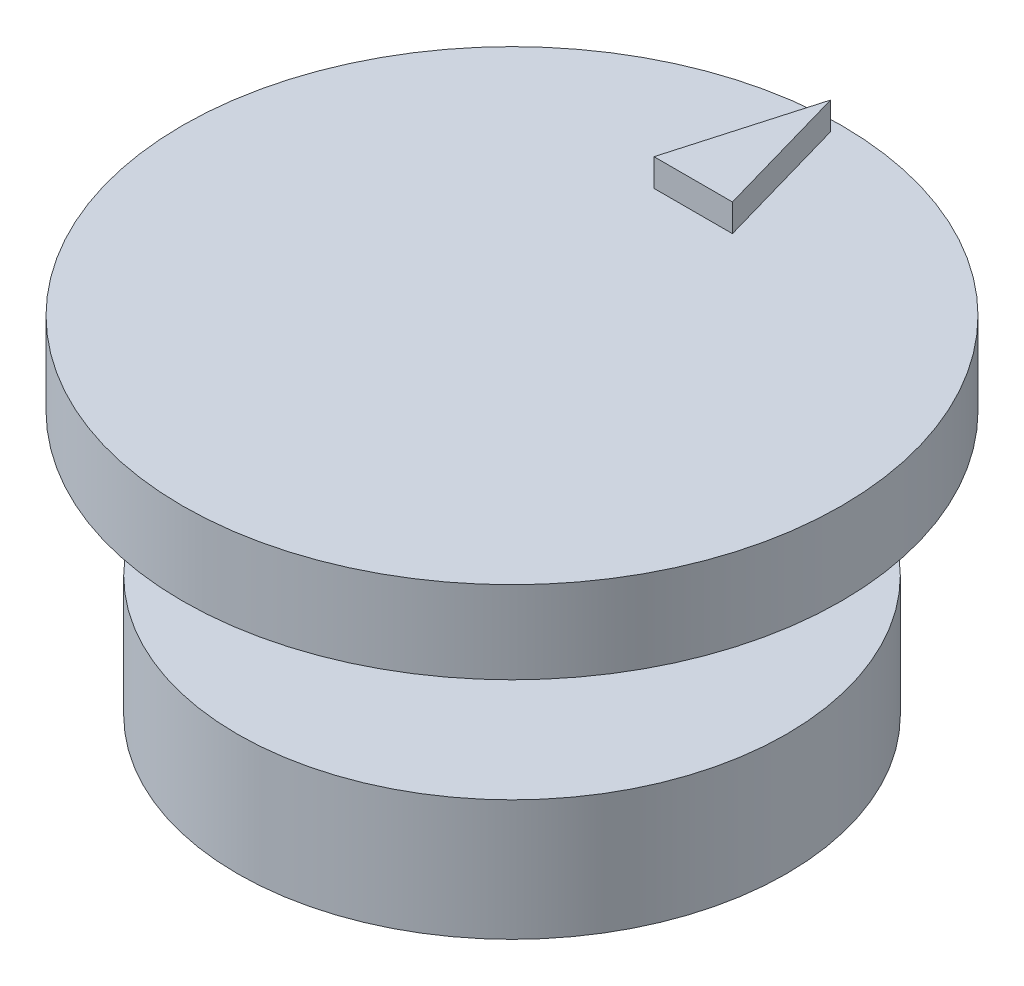
ISO-10303-21;
HEADER;
FILE_DESCRIPTION(('STEP AP214'),'2;1');
FILE_NAME('part.step','',(''),(''),'','','');
FILE_SCHEMA(('AUTOMOTIVE_DESIGN { 1 0 10303 214 1 1 1 1 }'));
ENDSEC;
DATA;
#1=APPLICATION_CONTEXT('core data for automotive mechanical design processes');
#2=APPLICATION_PROTOCOL_DEFINITION('international standard','automotive_design',2000,#1);
#3=PRODUCT_CONTEXT('',#1,'mechanical');
#4=PRODUCT('Part','Part','',(#3));
#5=PRODUCT_RELATED_PRODUCT_CATEGORY('part','',(#4));
#6=PRODUCT_DEFINITION_FORMATION('','',#4);
#7=PRODUCT_DEFINITION_CONTEXT('part definition',#1,'design');
#8=PRODUCT_DEFINITION('design','',#6,#7);
#9=PRODUCT_DEFINITION_SHAPE('','',#8);
#10=(LENGTH_UNIT() NAMED_UNIT(*) SI_UNIT(.MILLI.,.METRE.));
#11=(NAMED_UNIT(*) PLANE_ANGLE_UNIT() SI_UNIT($,.RADIAN.));
#12=(NAMED_UNIT(*) SI_UNIT($,.STERADIAN.) SOLID_ANGLE_UNIT());
#13=UNCERTAINTY_MEASURE_WITH_UNIT(LENGTH_MEASURE(1.E-05),#10,'distance_accuracy_value','');
#14=(GEOMETRIC_REPRESENTATION_CONTEXT(3) GLOBAL_UNCERTAINTY_ASSIGNED_CONTEXT((#13)) GLOBAL_UNIT_ASSIGNED_CONTEXT((#10,
#11,#12)) REPRESENTATION_CONTEXT('',''));
#15=CARTESIAN_POINT('',(0.,0.,0.));
#16=DIRECTION('',(0.,0.,1.));
#17=DIRECTION('',(1.,0.,0.));
#18=AXIS2_PLACEMENT_3D('',#15,#16,#17);
#19=CARTESIAN_POINT('',(0.,-36.8930584239754,0.));
#20=DIRECTION('',(0.,1.,0.));
#21=DIRECTION('',(-1.,0.,0.));
#22=AXIS2_PLACEMENT_3D('',#19,#20,#21);
#23=PLANE('',#22);
#24=CARTESIAN_POINT('',(0.,-36.8930584239754,0.));
#25=DIRECTION('',(0.,1.,0.));
#26=DIRECTION('',(-1.,0.,0.));
#27=AXIS2_PLACEMENT_3D('',#24,#25,#26);
#28=CIRCLE('',#27,12.7);
#29=CARTESIAN_POINT('',(-12.7,-36.8930584239754,0.));
#30=VERTEX_POINT('',#29);
#31=EDGE_CURVE('E40',#30,#30,#28,.T.);
#32=ORIENTED_EDGE('',*,*,#31,.F.);
#33=EDGE_LOOP('',(#32));
#34=FACE_BOUND('',#33,.T.);
#35=CARTESIAN_POINT('',(0.,-36.8930584239754,-9.85491099897473));
#36=DIRECTION('',(0.,1.,0.));
#37=DIRECTION('',(-1.,0.,0.));
#38=AXIS2_PLACEMENT_3D('',#35,#36,#37);
#39=CIRCLE('',#38,2.286);
#40=CARTESIAN_POINT('',(-2.286,-36.8930584239754,-9.85491099897473));
#41=VERTEX_POINT('',#40);
#42=EDGE_CURVE('E11',#41,#41,#39,.F.);
#43=ORIENTED_EDGE('',*,*,#42,.F.);
#44=EDGE_LOOP('',(#43));
#45=FACE_BOUND('',#44,.T.);
#46=ADVANCED_FACE('F32',(#34,#45),#23,.F.);
#47=CARTESIAN_POINT('',(15.24,-20.8910584239754,0.));
#48=DIRECTION('',(0.,-1.,0.));
#49=DIRECTION('',(1.,0.,0.));
#50=AXIS2_PLACEMENT_3D('',#47,#48,#49);
#51=PLANE('',#50);
#52=CARTESIAN_POINT('',(0.,-20.8910584239754,0.));
#53=DIRECTION('',(0.,1.,0.));
#54=DIRECTION('',(-1.,0.,0.));
#55=AXIS2_PLACEMENT_3D('',#52,#53,#54);
#56=CIRCLE('',#55,15.24);
#57=CARTESIAN_POINT('',(-15.24,-20.8910584239754,0.));
#58=VERTEX_POINT('',#57);
#59=EDGE_CURVE('E85',#58,#58,#56,.T.);
#60=ORIENTED_EDGE('',*,*,#59,.T.);
#61=EDGE_LOOP('',(#60));
#62=FACE_BOUND('',#61,.T.);
#63=DIRECTION('',(-0.274670324174725,0.,-0.961538461538461));
#64=VECTOR('',#63,1.);
#65=CARTESIAN_POINT('',(1.81392282084988,-20.8910584239754,-8.382));
#66=LINE('',#65,#64);
#67=CARTESIAN_POINT('',(1.81392282084988,-20.8910584239754,-8.382));
#68=VERTEX_POINT('',#67);
#69=CARTESIAN_POINT('',(0.,-20.8910584239754,-14.732));
#70=VERTEX_POINT('',#69);
#71=EDGE_CURVE('E84',#68,#70,#66,.T.);
#72=ORIENTED_EDGE('',*,*,#71,.F.);
#73=DIRECTION('',(1.,0.,0.));
#74=VECTOR('',#73,1.);
#75=CARTESIAN_POINT('',(-1.81392282084988,-20.8910584239754,-8.382));
#76=LINE('',#75,#74);
#77=CARTESIAN_POINT('',(-1.81392282084988,-20.8910584239754,-8.382));
#78=VERTEX_POINT('',#77);
#79=EDGE_CURVE('E51',#78,#68,#76,.T.);
#80=ORIENTED_EDGE('',*,*,#79,.F.);
#81=DIRECTION('',(-0.274670324174725,0.,0.961538461538461));
#82=VECTOR('',#81,1.);
#83=CARTESIAN_POINT('',(0.,-20.8910584239754,-14.732));
#84=LINE('',#83,#82);
#85=EDGE_CURVE('E47',#70,#78,#84,.T.);
#86=ORIENTED_EDGE('',*,*,#85,.F.);
#87=EDGE_LOOP('',(#72,#80,#86));
#88=FACE_BOUND('',#87,.T.);
#89=ADVANCED_FACE('F34',(#62,#88),#51,.F.);
#90=CARTESIAN_POINT('',(0.,-20.8910584239754,0.));
#91=DIRECTION('',(0.,1.,0.));
#92=DIRECTION('',(-1.,0.,0.));
#93=AXIS2_PLACEMENT_3D('',#90,#91,#92);
#94=CYLINDRICAL_SURFACE('',#93,12.7);
#95=CARTESIAN_POINT('',(0.,-31.3050584239754,0.));
#96=DIRECTION('',(0.,1.,0.));
#97=DIRECTION('',(-1.,0.,0.));
#98=AXIS2_PLACEMENT_3D('',#95,#96,#97);
#99=CIRCLE('',#98,12.7);
#100=CARTESIAN_POINT('',(-12.7,-31.3050584239754,0.));
#101=VERTEX_POINT('',#100);
#102=EDGE_CURVE('E108',#101,#101,#99,.T.);
#103=ORIENTED_EDGE('',*,*,#102,.F.);
#104=EDGE_LOOP('',(#103));
#105=FACE_BOUND('',#104,.T.);
#106=ORIENTED_EDGE('',*,*,#31,.T.);
#107=EDGE_LOOP('',(#106));
#108=FACE_BOUND('',#107,.T.);
#109=ADVANCED_FACE('F113',(#105,#108),#94,.T.);
#110=CARTESIAN_POINT('',(12.7,-31.3050584239754,0.));
#111=DIRECTION('',(0.,-1.,0.));
#112=DIRECTION('',(1.,0.,0.));
#113=AXIS2_PLACEMENT_3D('',#110,#111,#112);
#114=PLANE('',#113);
#115=CARTESIAN_POINT('',(0.,-31.3050584239754,0.));
#116=DIRECTION('',(0.,1.,0.));
#117=DIRECTION('',(-1.,0.,0.));
#118=AXIS2_PLACEMENT_3D('',#115,#116,#117);
#119=CIRCLE('',#118,3.175);
#120=CARTESIAN_POINT('',(-3.175,-31.3050584239754,0.));
#121=VERTEX_POINT('',#120);
#122=EDGE_CURVE('E105',#121,#121,#119,.T.);
#123=ORIENTED_EDGE('',*,*,#122,.F.);
#124=EDGE_LOOP('',(#123));
#125=FACE_BOUND('',#124,.T.);
#126=ORIENTED_EDGE('',*,*,#102,.T.);
#127=EDGE_LOOP('',(#126));
#128=FACE_BOUND('',#127,.T.);
#129=ADVANCED_FACE('F160',(#125,#128),#114,.F.);
#130=CARTESIAN_POINT('',(0.,-20.8910584239754,0.));
#131=DIRECTION('',(0.,1.,0.));
#132=DIRECTION('',(-1.,0.,0.));
#133=AXIS2_PLACEMENT_3D('',#130,#131,#132);
#134=CYLINDRICAL_SURFACE('',#133,3.175);
#135=CARTESIAN_POINT('',(0.,-26.2250584239754,0.));
#136=DIRECTION('',(0.,1.,0.));
#137=DIRECTION('',(-1.,0.,0.));
#138=AXIS2_PLACEMENT_3D('',#135,#136,#137);
#139=CIRCLE('',#138,3.175);
#140=CARTESIAN_POINT('',(-3.175,-26.2250584239754,0.));
#141=VERTEX_POINT('',#140);
#142=EDGE_CURVE('E102',#141,#141,#139,.T.);
#143=ORIENTED_EDGE('',*,*,#142,.F.);
#144=EDGE_LOOP('',(#143));
#145=FACE_BOUND('',#144,.T.);
#146=ORIENTED_EDGE('',*,*,#122,.T.);
#147=EDGE_LOOP('',(#146));
#148=FACE_BOUND('',#147,.T.);
#149=ADVANCED_FACE('F156',(#145,#148),#134,.T.);
#150=CARTESIAN_POINT('',(3.175,-26.2250584239754,0.));
#151=DIRECTION('',(0.,1.,0.));
#152=DIRECTION('',(-1.,0.,0.));
#153=AXIS2_PLACEMENT_3D('',#150,#151,#152);
#154=PLANE('',#153);
#155=CARTESIAN_POINT('',(0.,-26.2250584239754,0.));
#156=DIRECTION('',(0.,1.,0.));
#157=DIRECTION('',(-1.,0.,0.));
#158=AXIS2_PLACEMENT_3D('',#155,#156,#157);
#159=CIRCLE('',#158,12.7);
#160=CARTESIAN_POINT('',(-12.7,-26.2250584239754,0.));
#161=VERTEX_POINT('',#160);
#162=EDGE_CURVE('E99',#161,#161,#159,.T.);
#163=ORIENTED_EDGE('',*,*,#162,.F.);
#164=EDGE_LOOP('',(#163));
#165=FACE_BOUND('',#164,.T.);
#166=ORIENTED_EDGE('',*,*,#142,.T.);
#167=EDGE_LOOP('',(#166));
#168=FACE_BOUND('',#167,.T.);
#169=ADVANCED_FACE('F152',(#165,#168),#154,.F.);
#170=CARTESIAN_POINT('',(0.,-20.8910584239754,0.));
#171=DIRECTION('',(0.,1.,0.));
#172=DIRECTION('',(-1.,0.,0.));
#173=AXIS2_PLACEMENT_3D('',#170,#171,#172);
#174=CYLINDRICAL_SURFACE('',#173,12.7);
#175=CARTESIAN_POINT('',(0.,-24.7010584239754,0.));
#176=DIRECTION('',(0.,1.,0.));
#177=DIRECTION('',(-1.,0.,0.));
#178=AXIS2_PLACEMENT_3D('',#175,#176,#177);
#179=CIRCLE('',#178,12.7);
#180=CARTESIAN_POINT('',(-12.7,-24.7010584239754,0.));
#181=VERTEX_POINT('',#180);
#182=EDGE_CURVE('E96',#181,#181,#179,.T.);
#183=ORIENTED_EDGE('',*,*,#182,.F.);
#184=EDGE_LOOP('',(#183));
#185=FACE_BOUND('',#184,.T.);
#186=ORIENTED_EDGE('',*,*,#162,.T.);
#187=EDGE_LOOP('',(#186));
#188=FACE_BOUND('',#187,.T.);
#189=ADVANCED_FACE('F148',(#185,#188),#174,.T.);
#190=CARTESIAN_POINT('',(12.7,-24.7010584239754,0.));
#191=DIRECTION('',(0.,1.,0.));
#192=DIRECTION('',(-1.,0.,0.));
#193=AXIS2_PLACEMENT_3D('',#190,#191,#192);
#194=PLANE('',#193);
#195=CARTESIAN_POINT('',(0.,-24.7010584239754,0.));
#196=DIRECTION('',(0.,1.,0.));
#197=DIRECTION('',(-1.,0.,0.));
#198=AXIS2_PLACEMENT_3D('',#195,#196,#197);
#199=CIRCLE('',#198,15.24);
#200=CARTESIAN_POINT('',(-15.24,-24.7010584239754,0.));
#201=VERTEX_POINT('',#200);
#202=EDGE_CURVE('E88',#201,#201,#199,.T.);
#203=ORIENTED_EDGE('',*,*,#202,.F.);
#204=EDGE_LOOP('',(#203));
#205=FACE_BOUND('',#204,.T.);
#206=ORIENTED_EDGE('',*,*,#182,.T.);
#207=EDGE_LOOP('',(#206));
#208=FACE_BOUND('',#207,.T.);
#209=ADVANCED_FACE('F144',(#205,#208),#194,.F.);
#210=CARTESIAN_POINT('',(0.,-20.8910584239754,0.));
#211=DIRECTION('',(0.,1.,0.));
#212=DIRECTION('',(-1.,0.,0.));
#213=AXIS2_PLACEMENT_3D('',#210,#211,#212);
#214=CYLINDRICAL_SURFACE('',#213,15.24);
#215=ORIENTED_EDGE('',*,*,#59,.F.);
#216=EDGE_LOOP('',(#215));
#217=FACE_BOUND('',#216,.T.);
#218=ORIENTED_EDGE('',*,*,#202,.T.);
#219=EDGE_LOOP('',(#218));
#220=FACE_BOUND('',#219,.T.);
#221=ADVANCED_FACE('F141',(#217,#220),#214,.T.);
#222=CARTESIAN_POINT('',(1.81392282084988,-19.6210584239754,-8.382));
#223=DIRECTION('',(-0.961538461538461,0.,0.274670324174725));
#224=DIRECTION('',(0.274670324174725,0.,0.961538461538462));
#225=AXIS2_PLACEMENT_3D('',#222,#223,#224);
#226=PLANE('',#225);
#227=ORIENTED_EDGE('',*,*,#71,.T.);
#228=DIRECTION('',(0.,-1.,0.));
#229=VECTOR('',#228,1.);
#230=CARTESIAN_POINT('',(0.,-19.6210584239754,-14.732));
#231=LINE('',#230,#229);
#232=CARTESIAN_POINT('',(0.,-19.6210584239754,-14.732));
#233=VERTEX_POINT('',#232);
#234=EDGE_CURVE('E68',#233,#70,#231,.T.);
#235=ORIENTED_EDGE('',*,*,#234,.F.);
#236=DIRECTION('',(-0.274670324174725,0.,-0.961538461538461));
#237=VECTOR('',#236,1.);
#238=CARTESIAN_POINT('',(1.81392282084988,-19.6210584239754,-8.382));
#239=LINE('',#238,#237);
#240=CARTESIAN_POINT('',(1.81392282084988,-19.6210584239754,-8.382));
#241=VERTEX_POINT('',#240);
#242=EDGE_CURVE('E75',#241,#233,#239,.T.);
#243=ORIENTED_EDGE('',*,*,#242,.F.);
#244=DIRECTION('',(0.,-1.,0.));
#245=VECTOR('',#244,1.);
#246=CARTESIAN_POINT('',(1.81392282084988,-19.6210584239754,-8.382));
#247=LINE('',#246,#245);
#248=EDGE_CURVE('E90',#241,#68,#247,.T.);
#249=ORIENTED_EDGE('',*,*,#248,.T.);
#250=EDGE_LOOP('',(#227,#235,#243,#249));
#251=FACE_BOUND('',#250,.T.);
#252=ADVANCED_FACE('F83',(#251),#226,.F.);
#253=CARTESIAN_POINT('',(0.,-19.6210584239754,-14.732));
#254=DIRECTION('',(0.961538461538461,0.,0.274670324174725));
#255=DIRECTION('',(0.274670324174725,0.,-0.961538461538462));
#256=AXIS2_PLACEMENT_3D('',#253,#254,#255);
#257=PLANE('',#256);
#258=ORIENTED_EDGE('',*,*,#85,.T.);
#259=DIRECTION('',(0.,-1.,0.));
#260=VECTOR('',#259,1.);
#261=CARTESIAN_POINT('',(-1.81392282084988,-19.6210584239754,-8.382));
#262=LINE('',#261,#260);
#263=CARTESIAN_POINT('',(-1.81392282084988,-19.6210584239754,-8.382));
#264=VERTEX_POINT('',#263);
#265=EDGE_CURVE('E71',#264,#78,#262,.T.);
#266=ORIENTED_EDGE('',*,*,#265,.F.);
#267=DIRECTION('',(-0.274670324174725,0.,0.961538461538461));
#268=VECTOR('',#267,1.);
#269=CARTESIAN_POINT('',(0.,-19.6210584239754,-14.732));
#270=LINE('',#269,#268);
#271=EDGE_CURVE('E64',#233,#264,#270,.T.);
#272=ORIENTED_EDGE('',*,*,#271,.F.);
#273=ORIENTED_EDGE('',*,*,#234,.T.);
#274=EDGE_LOOP('',(#258,#266,#272,#273));
#275=FACE_BOUND('',#274,.T.);
#276=ADVANCED_FACE('F66',(#275),#257,.F.);
#277=CARTESIAN_POINT('',(-1.81392282084988,-19.6210584239754,-8.382));
#278=DIRECTION('',(0.,0.,-1.));
#279=DIRECTION('',(-1.,0.,0.));
#280=AXIS2_PLACEMENT_3D('',#277,#278,#279);
#281=PLANE('',#280);
#282=ORIENTED_EDGE('',*,*,#79,.T.);
#283=ORIENTED_EDGE('',*,*,#248,.F.);
#284=DIRECTION('',(1.,0.,0.));
#285=VECTOR('',#284,1.);
#286=CARTESIAN_POINT('',(-1.81392282084988,-19.6210584239754,-8.382));
#287=LINE('',#286,#285);
#288=EDGE_CURVE('E74',#264,#241,#287,.T.);
#289=ORIENTED_EDGE('',*,*,#288,.F.);
#290=ORIENTED_EDGE('',*,*,#265,.T.);
#291=EDGE_LOOP('',(#282,#283,#289,#290));
#292=FACE_BOUND('',#291,.T.);
#293=ADVANCED_FACE('F130',(#292),#281,.F.);
#294=CARTESIAN_POINT('',(0.,-19.6210584239754,0.));
#295=DIRECTION('',(0.,-1.,0.));
#296=DIRECTION('',(0.,0.,-1.));
#297=AXIS2_PLACEMENT_3D('',#294,#295,#296);
#298=PLANE('',#297);
#299=ORIENTED_EDGE('',*,*,#242,.T.);
#300=ORIENTED_EDGE('',*,*,#271,.T.);
#301=ORIENTED_EDGE('',*,*,#288,.T.);
#302=EDGE_LOOP('',(#299,#300,#301));
#303=FACE_BOUND('',#302,.T.);
#304=ADVANCED_FACE('F78',(#303),#298,.F.);
#305=CARTESIAN_POINT('',(0.,-43.2430584239754,-9.85491099897473));
#306=DIRECTION('',(0.,1.,0.));
#307=DIRECTION('',(-1.,0.,0.));
#308=AXIS2_PLACEMENT_3D('',#305,#306,#307);
#309=CYLINDRICAL_SURFACE('',#308,2.286);
#310=CARTESIAN_POINT('',(0.,-43.2430584239754,-9.85491099897473));
#311=DIRECTION('',(0.,-1.,0.));
#312=DIRECTION('',(1.,0.,0.));
#313=AXIS2_PLACEMENT_3D('',#310,#311,#312);
#314=CIRCLE('',#313,2.286);
#315=CARTESIAN_POINT('',(2.286,-43.2430584239754,-9.85491099897473));
#316=VERTEX_POINT('',#315);
#317=EDGE_CURVE('E176',#316,#316,#314,.T.);
#318=ORIENTED_EDGE('',*,*,#317,.F.);
#319=EDGE_LOOP('',(#318));
#320=FACE_BOUND('',#319,.T.);
#321=ORIENTED_EDGE('',*,*,#42,.T.);
#322=EDGE_LOOP('',(#321));
#323=FACE_BOUND('',#322,.T.);
#324=ADVANCED_FACE('F119',(#320,#323),#309,.T.);
#325=CARTESIAN_POINT('',(0.,-43.2430584239754,-9.85491099897473));
#326=DIRECTION('',(0.,-1.,0.));
#327=DIRECTION('',(1.,0.,0.));
#328=AXIS2_PLACEMENT_3D('',#325,#326,#327);
#329=PLANE('',#328);
#330=ORIENTED_EDGE('',*,*,#317,.T.);
#331=EDGE_LOOP('',(#330));
#332=FACE_BOUND('',#331,.T.);
#333=ADVANCED_FACE('F121',(#332),#329,.T.);
#334=CLOSED_SHELL('',(#46,#89,#109,#129,#149,#169,#189,#209,#221,#252,#276,#293,#304,#324,#333));
#335=MANIFOLD_SOLID_BREP('B2',#334);
#336=ADVANCED_BREP_SHAPE_REPRESENTATION('',(#18,#335),#14);
#337=SHAPE_DEFINITION_REPRESENTATION(#9,#336);
ENDSEC;
END-ISO-10303-21;
